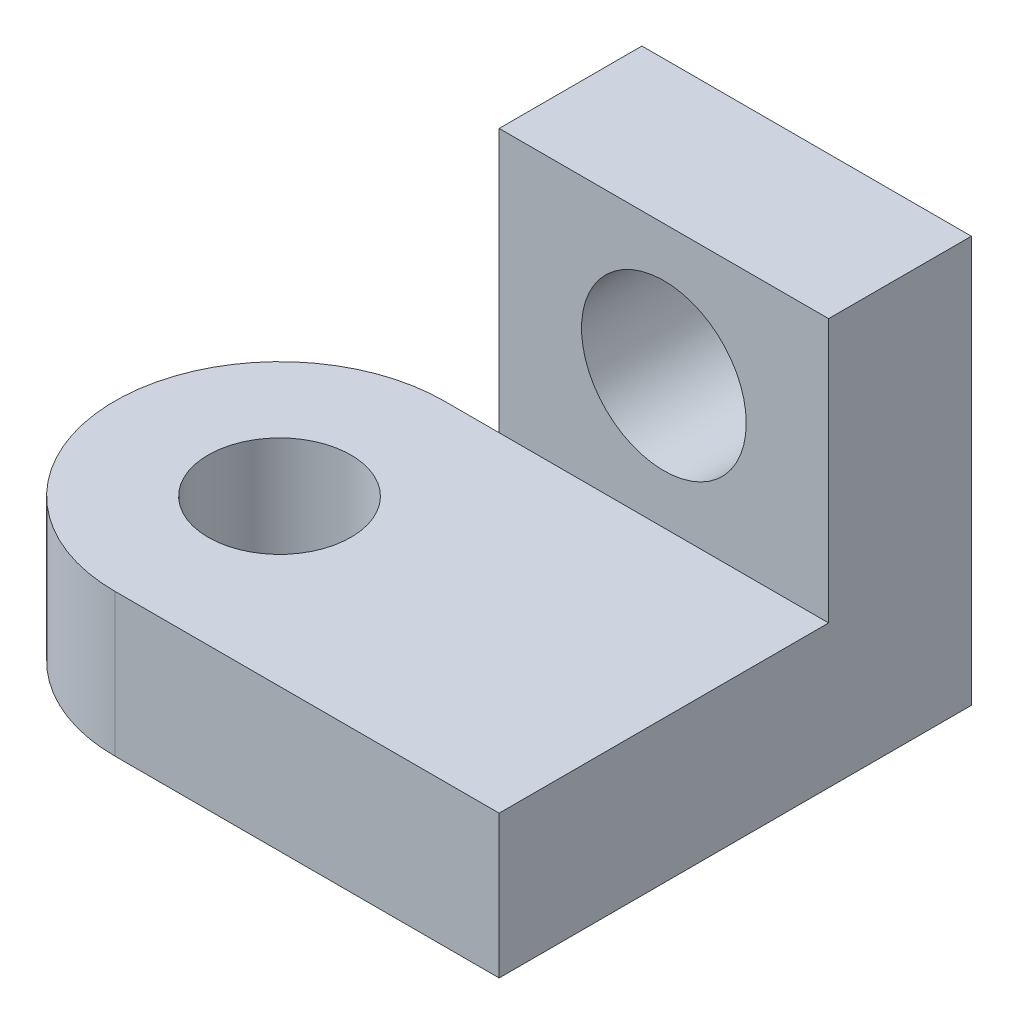
ISO-10303-21;
HEADER;
FILE_DESCRIPTION(('STEP AP214'),'2;1');
FILE_NAME('part.step','',(''),(''),'','','');
FILE_SCHEMA(('AUTOMOTIVE_DESIGN { 1 0 10303 214 1 1 1 1 }'));
ENDSEC;
DATA;
#1=APPLICATION_CONTEXT('core data for automotive mechanical design processes');
#2=APPLICATION_PROTOCOL_DEFINITION('international standard','automotive_design',2000,#1);
#3=PRODUCT_CONTEXT('',#1,'mechanical');
#4=PRODUCT('Part','Part','',(#3));
#5=PRODUCT_RELATED_PRODUCT_CATEGORY('part','',(#4));
#6=PRODUCT_DEFINITION_FORMATION('','',#4);
#7=PRODUCT_DEFINITION_CONTEXT('part definition',#1,'design');
#8=PRODUCT_DEFINITION('design','',#6,#7);
#9=PRODUCT_DEFINITION_SHAPE('','',#8);
#10=(LENGTH_UNIT() NAMED_UNIT(*) SI_UNIT(.MILLI.,.METRE.));
#11=(NAMED_UNIT(*) PLANE_ANGLE_UNIT() SI_UNIT($,.RADIAN.));
#12=(NAMED_UNIT(*) SI_UNIT($,.STERADIAN.) SOLID_ANGLE_UNIT());
#13=UNCERTAINTY_MEASURE_WITH_UNIT(LENGTH_MEASURE(1.E-05),#10,'distance_accuracy_value','');
#14=(GEOMETRIC_REPRESENTATION_CONTEXT(3) GLOBAL_UNCERTAINTY_ASSIGNED_CONTEXT((#13)) GLOBAL_UNIT_ASSIGNED_CONTEXT((#10,
#11,#12)) REPRESENTATION_CONTEXT('',''));
#15=CARTESIAN_POINT('',(0.,0.,0.));
#16=DIRECTION('',(0.,0.,1.));
#17=DIRECTION('',(1.,0.,0.));
#18=AXIS2_PLACEMENT_3D('',#15,#16,#17);
#19=CARTESIAN_POINT('',(30.,0.,0.));
#20=DIRECTION('',(0.,1.,0.));
#21=DIRECTION('',(0.,0.,1.));
#22=AXIS2_PLACEMENT_3D('',#19,#20,#21);
#23=PLANE('',#22);
#24=CARTESIAN_POINT('',(-5.,0.,28.));
#25=DIRECTION('',(0.,1.,0.));
#26=DIRECTION('',(0.,0.,1.));
#27=AXIS2_PLACEMENT_3D('',#24,#25,#26);
#28=CIRCLE('',#27,6.5);
#29=CARTESIAN_POINT('',(-5.,0.,34.5));
#30=VERTEX_POINT('',#29);
#31=EDGE_CURVE('E212',#30,#30,#28,.T.);
#32=ORIENTED_EDGE('',*,*,#31,.T.);
#33=EDGE_LOOP('',(#32));
#34=FACE_BOUND('',#33,.T.);
#35=DIRECTION('',(-1.,0.,0.));
#36=VECTOR('',#35,1.);
#37=CARTESIAN_POINT('',(30.,0.,43.));
#38=LINE('',#37,#36);
#39=CARTESIAN_POINT('',(30.,0.,43.));
#40=VERTEX_POINT('',#39);
#41=CARTESIAN_POINT('',(-5.,0.,43.));
#42=VERTEX_POINT('',#41);
#43=EDGE_CURVE('E123',#40,#42,#38,.T.);
#44=ORIENTED_EDGE('',*,*,#43,.T.);
#45=CARTESIAN_POINT('',(-5.,0.,28.));
#46=DIRECTION('',(0.,-1.,0.));
#47=DIRECTION('',(0.,0.,-1.));
#48=AXIS2_PLACEMENT_3D('',#45,#46,#47);
#49=CIRCLE('',#48,15.);
#50=CARTESIAN_POINT('',(-5.,0.,13.));
#51=VERTEX_POINT('',#50);
#52=EDGE_CURVE('E150',#42,#51,#49,.T.);
#53=ORIENTED_EDGE('',*,*,#52,.T.);
#54=DIRECTION('',(1.,0.,0.));
#55=VECTOR('',#54,1.);
#56=CARTESIAN_POINT('',(-5.,0.,13.));
#57=LINE('',#56,#55);
#58=CARTESIAN_POINT('',(0.,0.,13.));
#59=VERTEX_POINT('',#58);
#60=EDGE_CURVE('E146',#51,#59,#57,.T.);
#61=ORIENTED_EDGE('',*,*,#60,.T.);
#62=DIRECTION('',(0.,0.,-1.));
#63=VECTOR('',#62,1.);
#64=CARTESIAN_POINT('',(0.,0.,0.));
#65=LINE('',#64,#63);
#66=CARTESIAN_POINT('',(0.,0.,0.));
#67=VERTEX_POINT('',#66);
#68=EDGE_CURVE('E127',#59,#67,#65,.T.);
#69=ORIENTED_EDGE('',*,*,#68,.T.);
#70=DIRECTION('',(-1.,0.,0.));
#71=VECTOR('',#70,1.);
#72=CARTESIAN_POINT('',(30.,0.,0.));
#73=LINE('',#72,#71);
#74=CARTESIAN_POINT('',(30.,0.,0.));
#75=VERTEX_POINT('',#74);
#76=EDGE_CURVE('E11',#75,#67,#73,.T.);
#77=ORIENTED_EDGE('',*,*,#76,.F.);
#78=DIRECTION('',(0.,0.,-1.));
#79=VECTOR('',#78,1.);
#80=CARTESIAN_POINT('',(30.,0.,0.));
#81=LINE('',#80,#79);
#82=EDGE_CURVE('E134',#40,#75,#81,.T.);
#83=ORIENTED_EDGE('',*,*,#82,.F.);
#84=EDGE_LOOP('',(#44,#53,#61,#69,#77,#83));
#85=FACE_BOUND('',#84,.T.);
#86=ADVANCED_FACE('F39',(#34,#85),#23,.F.);
#87=CARTESIAN_POINT('',(30.,0.,0.));
#88=DIRECTION('',(0.,0.,1.));
#89=DIRECTION('',(1.,0.,0.));
#90=AXIS2_PLACEMENT_3D('',#87,#88,#89);
#91=PLANE('',#90);
#92=CARTESIAN_POINT('',(15.,25.,0.));
#93=DIRECTION('',(0.,0.,1.));
#94=DIRECTION('',(1.,0.,0.));
#95=AXIS2_PLACEMENT_3D('',#92,#93,#94);
#96=CIRCLE('',#95,7.5);
#97=CARTESIAN_POINT('',(22.5,25.,0.));
#98=VERTEX_POINT('',#97);
#99=EDGE_CURVE('E204',#98,#98,#96,.T.);
#100=ORIENTED_EDGE('',*,*,#99,.T.);
#101=EDGE_LOOP('',(#100));
#102=FACE_BOUND('',#101,.T.);
#103=DIRECTION('',(0.,1.,0.));
#104=VECTOR('',#103,1.);
#105=CARTESIAN_POINT('',(0.,0.,0.));
#106=LINE('',#105,#104);
#107=CARTESIAN_POINT('',(0.,37.,0.));
#108=VERTEX_POINT('',#107);
#109=EDGE_CURVE('E129',#67,#108,#106,.T.);
#110=ORIENTED_EDGE('',*,*,#109,.T.);
#111=DIRECTION('',(-1.,0.,0.));
#112=VECTOR('',#111,1.);
#113=CARTESIAN_POINT('',(30.,37.,0.));
#114=LINE('',#113,#112);
#115=CARTESIAN_POINT('',(30.,37.,0.));
#116=VERTEX_POINT('',#115);
#117=EDGE_CURVE('E47',#116,#108,#114,.T.);
#118=ORIENTED_EDGE('',*,*,#117,.F.);
#119=DIRECTION('',(0.,1.,0.));
#120=VECTOR('',#119,1.);
#121=CARTESIAN_POINT('',(30.,0.,0.));
#122=LINE('',#121,#120);
#123=EDGE_CURVE('E89',#75,#116,#122,.T.);
#124=ORIENTED_EDGE('',*,*,#123,.F.);
#125=ORIENTED_EDGE('',*,*,#76,.T.);
#126=EDGE_LOOP('',(#110,#118,#124,#125));
#127=FACE_BOUND('',#126,.T.);
#128=ADVANCED_FACE('F161',(#102,#127),#91,.F.);
#129=CARTESIAN_POINT('',(30.,37.,0.));
#130=DIRECTION('',(0.,-1.,0.));
#131=DIRECTION('',(0.,0.,-1.));
#132=AXIS2_PLACEMENT_3D('',#129,#130,#131);
#133=PLANE('',#132);
#134=DIRECTION('',(0.,0.,1.));
#135=VECTOR('',#134,1.);
#136=CARTESIAN_POINT('',(0.,37.,0.));
#137=LINE('',#136,#135);
#138=CARTESIAN_POINT('',(0.,37.,13.));
#139=VERTEX_POINT('',#138);
#140=EDGE_CURVE('E73',#108,#139,#137,.T.);
#141=ORIENTED_EDGE('',*,*,#140,.T.);
#142=DIRECTION('',(-1.,0.,0.));
#143=VECTOR('',#142,1.);
#144=CARTESIAN_POINT('',(30.,37.,13.));
#145=LINE('',#144,#143);
#146=CARTESIAN_POINT('',(30.,37.,13.));
#147=VERTEX_POINT('',#146);
#148=EDGE_CURVE('E116',#147,#139,#145,.T.);
#149=ORIENTED_EDGE('',*,*,#148,.F.);
#150=DIRECTION('',(0.,0.,1.));
#151=VECTOR('',#150,1.);
#152=CARTESIAN_POINT('',(30.,37.,0.));
#153=LINE('',#152,#151);
#154=EDGE_CURVE('E106',#116,#147,#153,.T.);
#155=ORIENTED_EDGE('',*,*,#154,.F.);
#156=ORIENTED_EDGE('',*,*,#117,.T.);
#157=EDGE_LOOP('',(#141,#149,#155,#156));
#158=FACE_BOUND('',#157,.T.);
#159=ADVANCED_FACE('F138',(#158),#133,.F.);
#160=CARTESIAN_POINT('',(30.,37.,13.));
#161=DIRECTION('',(0.,0.,-1.));
#162=DIRECTION('',(0.,1.,0.));
#163=AXIS2_PLACEMENT_3D('',#160,#161,#162);
#164=PLANE('',#163);
#165=CARTESIAN_POINT('',(15.,25.,13.));
#166=DIRECTION('',(0.,0.,1.));
#167=DIRECTION('',(1.,0.,0.));
#168=AXIS2_PLACEMENT_3D('',#165,#166,#167);
#169=CIRCLE('',#168,7.5);
#170=CARTESIAN_POINT('',(22.5,25.,13.));
#171=VERTEX_POINT('',#170);
#172=EDGE_CURVE('E207',#171,#171,#169,.T.);
#173=ORIENTED_EDGE('',*,*,#172,.F.);
#174=EDGE_LOOP('',(#173));
#175=FACE_BOUND('',#174,.T.);
#176=DIRECTION('',(0.,-1.,0.));
#177=VECTOR('',#176,1.);
#178=CARTESIAN_POINT('',(0.,37.,13.));
#179=LINE('',#178,#177);
#180=CARTESIAN_POINT('',(0.,13.,13.));
#181=VERTEX_POINT('',#180);
#182=EDGE_CURVE('E114',#139,#181,#179,.T.);
#183=ORIENTED_EDGE('',*,*,#182,.T.);
#184=DIRECTION('',(-1.,0.,0.));
#185=VECTOR('',#184,1.);
#186=CARTESIAN_POINT('',(30.,13.,13.));
#187=LINE('',#186,#185);
#188=CARTESIAN_POINT('',(30.,13.,13.));
#189=VERTEX_POINT('',#188);
#190=EDGE_CURVE('E111',#189,#181,#187,.T.);
#191=ORIENTED_EDGE('',*,*,#190,.F.);
#192=DIRECTION('',(0.,-1.,0.));
#193=VECTOR('',#192,1.);
#194=CARTESIAN_POINT('',(30.,37.,13.));
#195=LINE('',#194,#193);
#196=EDGE_CURVE('E99',#147,#189,#195,.T.);
#197=ORIENTED_EDGE('',*,*,#196,.F.);
#198=ORIENTED_EDGE('',*,*,#148,.T.);
#199=EDGE_LOOP('',(#183,#191,#197,#198));
#200=FACE_BOUND('',#199,.T.);
#201=ADVANCED_FACE('F112',(#175,#200),#164,.F.);
#202=CARTESIAN_POINT('',(30.,13.,13.));
#203=DIRECTION('',(0.,-1.,0.));
#204=DIRECTION('',(0.,0.,-1.));
#205=AXIS2_PLACEMENT_3D('',#202,#203,#204);
#206=PLANE('',#205);
#207=CARTESIAN_POINT('',(-5.,13.,28.));
#208=DIRECTION('',(0.,1.,0.));
#209=DIRECTION('',(0.,0.,1.));
#210=AXIS2_PLACEMENT_3D('',#207,#208,#209);
#211=CIRCLE('',#210,6.5);
#212=CARTESIAN_POINT('',(-5.,13.,34.5));
#213=VERTEX_POINT('',#212);
#214=EDGE_CURVE('E209',#213,#213,#211,.T.);
#215=ORIENTED_EDGE('',*,*,#214,.F.);
#216=EDGE_LOOP('',(#215));
#217=FACE_BOUND('',#216,.T.);
#218=ORIENTED_EDGE('',*,*,#190,.T.);
#219=DIRECTION('',(1.,0.,0.));
#220=VECTOR('',#219,1.);
#221=CARTESIAN_POINT('',(-5.,13.,13.));
#222=LINE('',#221,#220);
#223=CARTESIAN_POINT('',(-5.,13.,13.));
#224=VERTEX_POINT('',#223);
#225=EDGE_CURVE('E81',#224,#181,#222,.T.);
#226=ORIENTED_EDGE('',*,*,#225,.F.);
#227=CARTESIAN_POINT('',(-5.,13.,28.));
#228=DIRECTION('',(0.,-1.,0.));
#229=DIRECTION('',(0.,0.,-1.));
#230=AXIS2_PLACEMENT_3D('',#227,#228,#229);
#231=CIRCLE('',#230,15.);
#232=CARTESIAN_POINT('',(-5.,13.,43.));
#233=VERTEX_POINT('',#232);
#234=EDGE_CURVE('E215',#233,#224,#231,.T.);
#235=ORIENTED_EDGE('',*,*,#234,.F.);
#236=DIRECTION('',(-1.,0.,0.));
#237=VECTOR('',#236,1.);
#238=CARTESIAN_POINT('',(30.,13.,43.));
#239=LINE('',#238,#237);
#240=CARTESIAN_POINT('',(30.,13.,43.));
#241=VERTEX_POINT('',#240);
#242=EDGE_CURVE('E117',#241,#233,#239,.T.);
#243=ORIENTED_EDGE('',*,*,#242,.F.);
#244=DIRECTION('',(0.,0.,1.));
#245=VECTOR('',#244,1.);
#246=CARTESIAN_POINT('',(30.,13.,13.));
#247=LINE('',#246,#245);
#248=EDGE_CURVE('E103',#189,#241,#247,.T.);
#249=ORIENTED_EDGE('',*,*,#248,.F.);
#250=EDGE_LOOP('',(#218,#226,#235,#243,#249));
#251=FACE_BOUND('',#250,.T.);
#252=ADVANCED_FACE('F119',(#217,#251),#206,.F.);
#253=CARTESIAN_POINT('',(30.,13.,43.));
#254=DIRECTION('',(0.,0.,-1.));
#255=DIRECTION('',(-1.,0.,0.));
#256=AXIS2_PLACEMENT_3D('',#253,#254,#255);
#257=PLANE('',#256);
#258=ORIENTED_EDGE('',*,*,#242,.T.);
#259=DIRECTION('',(0.,1.,0.));
#260=VECTOR('',#259,1.);
#261=CARTESIAN_POINT('',(-5.,0.,43.));
#262=LINE('',#261,#260);
#263=EDGE_CURVE('E130',#42,#233,#262,.T.);
#264=ORIENTED_EDGE('',*,*,#263,.F.);
#265=ORIENTED_EDGE('',*,*,#43,.F.);
#266=DIRECTION('',(0.,-1.,0.));
#267=VECTOR('',#266,1.);
#268=CARTESIAN_POINT('',(30.,13.,43.));
#269=LINE('',#268,#267);
#270=EDGE_CURVE('E55',#241,#40,#269,.T.);
#271=ORIENTED_EDGE('',*,*,#270,.F.);
#272=EDGE_LOOP('',(#258,#264,#265,#271));
#273=FACE_BOUND('',#272,.T.);
#274=ADVANCED_FACE('F178',(#273),#257,.F.);
#275=CARTESIAN_POINT('',(30.,0.,0.));
#276=DIRECTION('',(1.,0.,0.));
#277=DIRECTION('',(0.,0.,-1.));
#278=AXIS2_PLACEMENT_3D('',#275,#276,#277);
#279=PLANE('',#278);
#280=ORIENTED_EDGE('',*,*,#82,.T.);
#281=ORIENTED_EDGE('',*,*,#123,.T.);
#282=ORIENTED_EDGE('',*,*,#154,.T.);
#283=ORIENTED_EDGE('',*,*,#196,.T.);
#284=ORIENTED_EDGE('',*,*,#248,.T.);
#285=ORIENTED_EDGE('',*,*,#270,.T.);
#286=EDGE_LOOP('',(#280,#281,#282,#283,#284,#285));
#287=FACE_BOUND('',#286,.T.);
#288=ADVANCED_FACE('F101',(#287),#279,.T.);
#289=CARTESIAN_POINT('',(0.,0.,0.));
#290=DIRECTION('',(1.,0.,0.));
#291=DIRECTION('',(0.,0.,-1.));
#292=AXIS2_PLACEMENT_3D('',#289,#290,#291);
#293=PLANE('',#292);
#294=ORIENTED_EDGE('',*,*,#68,.F.);
#295=DIRECTION('',(0.,1.,0.));
#296=VECTOR('',#295,1.);
#297=CARTESIAN_POINT('',(0.,0.,13.));
#298=LINE('',#297,#296);
#299=EDGE_CURVE('E143',#59,#181,#298,.T.);
#300=ORIENTED_EDGE('',*,*,#299,.T.);
#301=ORIENTED_EDGE('',*,*,#182,.F.);
#302=ORIENTED_EDGE('',*,*,#140,.F.);
#303=ORIENTED_EDGE('',*,*,#109,.F.);
#304=EDGE_LOOP('',(#294,#300,#301,#302,#303));
#305=FACE_BOUND('',#304,.T.);
#306=ADVANCED_FACE('F142',(#305),#293,.F.);
#307=CARTESIAN_POINT('',(-5.,0.,28.));
#308=DIRECTION('',(0.,1.,0.));
#309=DIRECTION('',(0.,0.,1.));
#310=AXIS2_PLACEMENT_3D('',#307,#308,#309);
#311=CYLINDRICAL_SURFACE('',#310,15.);
#312=ORIENTED_EDGE('',*,*,#234,.T.);
#313=DIRECTION('',(0.,1.,0.));
#314=VECTOR('',#313,1.);
#315=CARTESIAN_POINT('',(-5.,0.,13.));
#316=LINE('',#315,#314);
#317=EDGE_CURVE('E145',#51,#224,#316,.T.);
#318=ORIENTED_EDGE('',*,*,#317,.F.);
#319=ORIENTED_EDGE('',*,*,#52,.F.);
#320=ORIENTED_EDGE('',*,*,#263,.T.);
#321=EDGE_LOOP('',(#312,#318,#319,#320));
#322=FACE_BOUND('',#321,.T.);
#323=ADVANCED_FACE('F185',(#322),#311,.T.);
#324=CARTESIAN_POINT('',(-5.,0.,13.));
#325=DIRECTION('',(0.,0.,1.));
#326=DIRECTION('',(0.,-1.,0.));
#327=AXIS2_PLACEMENT_3D('',#324,#325,#326);
#328=PLANE('',#327);
#329=ORIENTED_EDGE('',*,*,#225,.T.);
#330=ORIENTED_EDGE('',*,*,#299,.F.);
#331=ORIENTED_EDGE('',*,*,#60,.F.);
#332=ORIENTED_EDGE('',*,*,#317,.T.);
#333=EDGE_LOOP('',(#329,#330,#331,#332));
#334=FACE_BOUND('',#333,.T.);
#335=ADVANCED_FACE('F190',(#334),#328,.F.);
#336=CARTESIAN_POINT('',(-5.,0.,28.));
#337=DIRECTION('',(0.,1.,0.));
#338=DIRECTION('',(0.,0.,1.));
#339=AXIS2_PLACEMENT_3D('',#336,#337,#338);
#340=CYLINDRICAL_SURFACE('',#339,6.5);
#341=CARTESIAN_POINT('',(-5.,0.,34.5));
#342=CARTESIAN_POINT('',(-5.,0.135416666666655,34.5));
#343=CARTESIAN_POINT('',(-5.,0.270833333333322,34.5));
#344=CARTESIAN_POINT('',(-5.,0.541666666666656,34.5));
#345=CARTESIAN_POINT('',(-5.,0.677083333333322,34.5));
#346=CARTESIAN_POINT('',(-5.,0.947916666666656,34.5));
#347=CARTESIAN_POINT('',(-5.,1.08333333333332,34.5));
#348=CARTESIAN_POINT('',(-5.,1.35416666666666,34.5));
#349=CARTESIAN_POINT('',(-5.,1.48958333333332,34.5));
#350=CARTESIAN_POINT('',(-5.,1.76041666666666,34.5));
#351=CARTESIAN_POINT('',(-5.,1.89583333333332,34.5));
#352=CARTESIAN_POINT('',(-5.,2.16666666666666,34.5));
#353=CARTESIAN_POINT('',(-5.,2.30208333333332,34.5));
#354=CARTESIAN_POINT('',(-5.,2.57291666666666,34.5));
#355=CARTESIAN_POINT('',(-5.,2.70833333333332,34.5));
#356=CARTESIAN_POINT('',(-5.,2.97916666666665,34.5));
#357=CARTESIAN_POINT('',(-5.,3.11458333333332,34.5));
#358=CARTESIAN_POINT('',(-5.,3.38541666666665,34.5));
#359=CARTESIAN_POINT('',(-5.,3.52083333333332,34.5));
#360=CARTESIAN_POINT('',(-5.,3.79166666666665,34.5));
#361=CARTESIAN_POINT('',(-5.,3.92708333333332,34.5));
#362=CARTESIAN_POINT('',(-5.,4.19791666666665,34.5));
#363=CARTESIAN_POINT('',(-5.,4.33333333333332,34.5));
#364=CARTESIAN_POINT('',(-5.,4.60416666666665,34.5));
#365=CARTESIAN_POINT('',(-5.,4.73958333333332,34.5));
#366=CARTESIAN_POINT('',(-5.,5.01041666666666,34.5));
#367=CARTESIAN_POINT('',(-5.,5.14583333333332,34.5));
#368=CARTESIAN_POINT('',(-5.,5.41666666666665,34.5));
#369=CARTESIAN_POINT('',(-5.,5.55208333333332,34.5));
#370=CARTESIAN_POINT('',(-5.,5.82291666666666,34.5));
#371=CARTESIAN_POINT('',(-5.,5.95833333333332,34.5));
#372=CARTESIAN_POINT('',(-5.,6.22916666666665,34.5));
#373=CARTESIAN_POINT('',(-5.,6.36458333333332,34.5));
#374=CARTESIAN_POINT('',(-5.,6.63541666666665,34.5));
#375=CARTESIAN_POINT('',(-5.,6.77083333333332,34.5));
#376=CARTESIAN_POINT('',(-5.,7.04166666666666,34.5));
#377=CARTESIAN_POINT('',(-5.,7.17708333333332,34.5));
#378=CARTESIAN_POINT('',(-5.,7.44791666666665,34.5));
#379=CARTESIAN_POINT('',(-5.,7.58333333333332,34.5));
#380=CARTESIAN_POINT('',(-5.,7.85416666666666,34.5));
#381=CARTESIAN_POINT('',(-5.,7.98958333333332,34.5));
#382=CARTESIAN_POINT('',(-5.,8.26041666666666,34.5));
#383=CARTESIAN_POINT('',(-5.,8.39583333333332,34.5));
#384=CARTESIAN_POINT('',(-5.,8.66666666666666,34.5));
#385=CARTESIAN_POINT('',(-5.,8.80208333333332,34.5));
#386=CARTESIAN_POINT('',(-5.,9.07291666666666,34.5));
#387=CARTESIAN_POINT('',(-5.,9.20833333333332,34.5));
#388=CARTESIAN_POINT('',(-5.,9.47916666666666,34.5));
#389=CARTESIAN_POINT('',(-5.,9.61458333333332,34.5));
#390=CARTESIAN_POINT('',(-5.,9.88541666666666,34.5));
#391=CARTESIAN_POINT('',(-5.,10.0208333333333,34.5));
#392=CARTESIAN_POINT('',(-5.,10.2916666666667,34.5));
#393=CARTESIAN_POINT('',(-5.,10.4270833333333,34.5));
#394=CARTESIAN_POINT('',(-5.,10.6979166666667,34.5));
#395=CARTESIAN_POINT('',(-5.,10.8333333333333,34.5));
#396=CARTESIAN_POINT('',(-5.,11.1041666666667,34.5));
#397=CARTESIAN_POINT('',(-5.,11.2395833333333,34.5));
#398=CARTESIAN_POINT('',(-5.,11.5104166666667,34.5));
#399=CARTESIAN_POINT('',(-5.,11.6458333333333,34.5));
#400=CARTESIAN_POINT('',(-5.,11.9166666666667,34.5));
#401=CARTESIAN_POINT('',(-5.,12.0520833333333,34.5));
#402=CARTESIAN_POINT('',(-5.,12.3229166666667,34.5));
#403=CARTESIAN_POINT('',(-5.,12.4583333333333,34.5));
#404=CARTESIAN_POINT('',(-5.,12.7291666666667,34.5));
#405=CARTESIAN_POINT('',(-5.,12.8645833333333,34.5));
#406=CARTESIAN_POINT('',(-5.,13.,34.5));
#407=B_SPLINE_CURVE_WITH_KNOTS('',3,(#341,#342,#343,#344,#345,#346,#347,#348,#349,#350,#351,
#352,#353,#354,#355,#356,#357,#358,#359,#360,#361,#362,#363,#364,#365,#366,#367,#368,#369,#370,
#371,#372,#373,#374,#375,#376,#377,#378,#379,#380,#381,#382,#383,#384,#385,#386,#387,#388,#389,
#390,#391,#392,#393,#394,#395,#396,#397,#398,#399,#400,#401,#402,#403,#404,#405,#406),
.UNSPECIFIED.,.F.,.F.,(4,2,2,2,2,2,2,2,2,2,2,2,2,2,2,2,2,2,2,2,2,2,2,2,2,2,2,2,2,2,2,2,4),(0.,
0.40625,0.8125,1.21875,1.625,2.03125,2.4375,2.84375,3.25,3.65625,4.0625,4.46875,4.875,5.28125,
5.6875,6.09375,6.5,6.90625,7.3125,7.71875,8.125,8.53125,8.9375,9.34375,9.75,10.15625,10.5625,
10.96875,11.375,11.78125,12.1875,12.59375,13.),.UNSPECIFIED.);
#408=EDGE_CURVE('BSEAM194',#30,#213,#407,.T.);
#409=ORIENTED_EDGE('',*,*,#31,.F.);
#410=ORIENTED_EDGE('',*,*,#214,.T.);
#411=ORIENTED_EDGE('',*,*,#408,.T.);
#412=ORIENTED_EDGE('',*,*,#408,.F.);
#413=EDGE_LOOP('',(#409,#411,#410,#412));
#414=FACE_BOUND('',#413,.T.);
#415=ADVANCED_FACE('F194',(#414),#340,.F.);
#416=CARTESIAN_POINT('',(15.,25.,0.));
#417=DIRECTION('',(0.,0.,1.));
#418=DIRECTION('',(1.,0.,0.));
#419=AXIS2_PLACEMENT_3D('',#416,#417,#418);
#420=CYLINDRICAL_SURFACE('',#419,7.5);
#421=CARTESIAN_POINT('',(22.5,25.,0.));
#422=CARTESIAN_POINT('',(22.5,25.,0.135416666666659));
#423=CARTESIAN_POINT('',(22.5,25.,0.270833333333326));
#424=CARTESIAN_POINT('',(22.5,25.,0.54166666666666));
#425=CARTESIAN_POINT('',(22.5,25.,0.677083333333326));
#426=CARTESIAN_POINT('',(22.5,25.,0.94791666666666));
#427=CARTESIAN_POINT('',(22.5,25.,1.08333333333333));
#428=CARTESIAN_POINT('',(22.5,25.,1.35416666666666));
#429=CARTESIAN_POINT('',(22.5,25.,1.48958333333333));
#430=CARTESIAN_POINT('',(22.5,25.,1.76041666666666));
#431=CARTESIAN_POINT('',(22.5,25.,1.89583333333333));
#432=CARTESIAN_POINT('',(22.5,25.,2.16666666666666));
#433=CARTESIAN_POINT('',(22.5,25.,2.30208333333333));
#434=CARTESIAN_POINT('',(22.5,25.,2.57291666666666));
#435=CARTESIAN_POINT('',(22.5,25.,2.70833333333333));
#436=CARTESIAN_POINT('',(22.5,25.,2.97916666666666));
#437=CARTESIAN_POINT('',(22.5,25.,3.11458333333333));
#438=CARTESIAN_POINT('',(22.5,25.,3.38541666666666));
#439=CARTESIAN_POINT('',(22.5,25.,3.52083333333333));
#440=CARTESIAN_POINT('',(22.5,25.,3.79166666666666));
#441=CARTESIAN_POINT('',(22.5,25.,3.92708333333333));
#442=CARTESIAN_POINT('',(22.5,25.,4.19791666666666));
#443=CARTESIAN_POINT('',(22.5,25.,4.33333333333333));
#444=CARTESIAN_POINT('',(22.5,25.,4.60416666666666));
#445=CARTESIAN_POINT('',(22.5,25.,4.73958333333333));
#446=CARTESIAN_POINT('',(22.5,25.,5.01041666666666));
#447=CARTESIAN_POINT('',(22.5,25.,5.14583333333333));
#448=CARTESIAN_POINT('',(22.5,25.,5.41666666666666));
#449=CARTESIAN_POINT('',(22.5,25.,5.55208333333333));
#450=CARTESIAN_POINT('',(22.5,25.,5.82291666666666));
#451=CARTESIAN_POINT('',(22.5,25.,5.95833333333333));
#452=CARTESIAN_POINT('',(22.5,25.,6.22916666666666));
#453=CARTESIAN_POINT('',(22.5,25.,6.36458333333333));
#454=CARTESIAN_POINT('',(22.5,25.,6.63541666666666));
#455=CARTESIAN_POINT('',(22.5,25.,6.77083333333333));
#456=CARTESIAN_POINT('',(22.5,25.,7.04166666666666));
#457=CARTESIAN_POINT('',(22.5,25.,7.17708333333333));
#458=CARTESIAN_POINT('',(22.5,25.,7.44791666666666));
#459=CARTESIAN_POINT('',(22.5,25.,7.58333333333333));
#460=CARTESIAN_POINT('',(22.5,25.,7.85416666666666));
#461=CARTESIAN_POINT('',(22.5,25.,7.98958333333333));
#462=CARTESIAN_POINT('',(22.5,25.,8.26041666666666));
#463=CARTESIAN_POINT('',(22.5,25.,8.39583333333333));
#464=CARTESIAN_POINT('',(22.5,25.,8.66666666666666));
#465=CARTESIAN_POINT('',(22.5,25.,8.80208333333333));
#466=CARTESIAN_POINT('',(22.5,25.,9.07291666666666));
#467=CARTESIAN_POINT('',(22.5,25.,9.20833333333333));
#468=CARTESIAN_POINT('',(22.5,25.,9.47916666666666));
#469=CARTESIAN_POINT('',(22.5,25.,9.61458333333333));
#470=CARTESIAN_POINT('',(22.5,25.,9.88541666666666));
#471=CARTESIAN_POINT('',(22.5,25.,10.0208333333333));
#472=CARTESIAN_POINT('',(22.5,25.,10.2916666666667));
#473=CARTESIAN_POINT('',(22.5,25.,10.4270833333333));
#474=CARTESIAN_POINT('',(22.5,25.,10.6979166666667));
#475=CARTESIAN_POINT('',(22.5,25.,10.8333333333333));
#476=CARTESIAN_POINT('',(22.5,25.,11.1041666666667));
#477=CARTESIAN_POINT('',(22.5,25.,11.2395833333333));
#478=CARTESIAN_POINT('',(22.5,25.,11.5104166666667));
#479=CARTESIAN_POINT('',(22.5,25.,11.6458333333333));
#480=CARTESIAN_POINT('',(22.5,25.,11.9166666666667));
#481=CARTESIAN_POINT('',(22.5,25.,12.0520833333333));
#482=CARTESIAN_POINT('',(22.5,25.,12.3229166666667));
#483=CARTESIAN_POINT('',(22.5,25.,12.4583333333333));
#484=CARTESIAN_POINT('',(22.5,25.,12.7291666666667));
#485=CARTESIAN_POINT('',(22.5,25.,12.8645833333333));
#486=CARTESIAN_POINT('',(22.5,25.,13.));
#487=B_SPLINE_CURVE_WITH_KNOTS('',3,(#421,#422,#423,#424,#425,#426,#427,#428,#429,#430,#431,
#432,#433,#434,#435,#436,#437,#438,#439,#440,#441,#442,#443,#444,#445,#446,#447,#448,#449,#450,
#451,#452,#453,#454,#455,#456,#457,#458,#459,#460,#461,#462,#463,#464,#465,#466,#467,#468,#469,
#470,#471,#472,#473,#474,#475,#476,#477,#478,#479,#480,#481,#482,#483,#484,#485,#486),
.UNSPECIFIED.,.F.,.F.,(4,2,2,2,2,2,2,2,2,2,2,2,2,2,2,2,2,2,2,2,2,2,2,2,2,2,2,2,2,2,2,2,4),(0.,
0.40625,0.8125,1.21875,1.625,2.03125,2.4375,2.84375,3.25,3.65625,4.0625,4.46875,4.875,5.28125,
5.6875,6.09375,6.5,6.90625,7.3125,7.71875,8.125,8.53125,8.9375,9.34375,9.75,10.15625,10.5625,
10.96875,11.375,11.78125,12.1875,12.59375,13.),.UNSPECIFIED.);
#488=EDGE_CURVE('BSEAM196',#98,#171,#487,.T.);
#489=ORIENTED_EDGE('',*,*,#99,.F.);
#490=ORIENTED_EDGE('',*,*,#172,.T.);
#491=ORIENTED_EDGE('',*,*,#488,.T.);
#492=ORIENTED_EDGE('',*,*,#488,.F.);
#493=EDGE_LOOP('',(#489,#491,#490,#492));
#494=FACE_BOUND('',#493,.T.);
#495=ADVANCED_FACE('F196',(#494),#420,.F.);
#496=CLOSED_SHELL('',(#86,#128,#159,#201,#252,#274,#288,#306,#323,#335,#415,#495));
#497=MANIFOLD_SOLID_BREP('B2',#496);
#498=ADVANCED_BREP_SHAPE_REPRESENTATION('',(#18,#497),#14);
#499=SHAPE_DEFINITION_REPRESENTATION(#9,#498);
ENDSEC;
END-ISO-10303-21;
